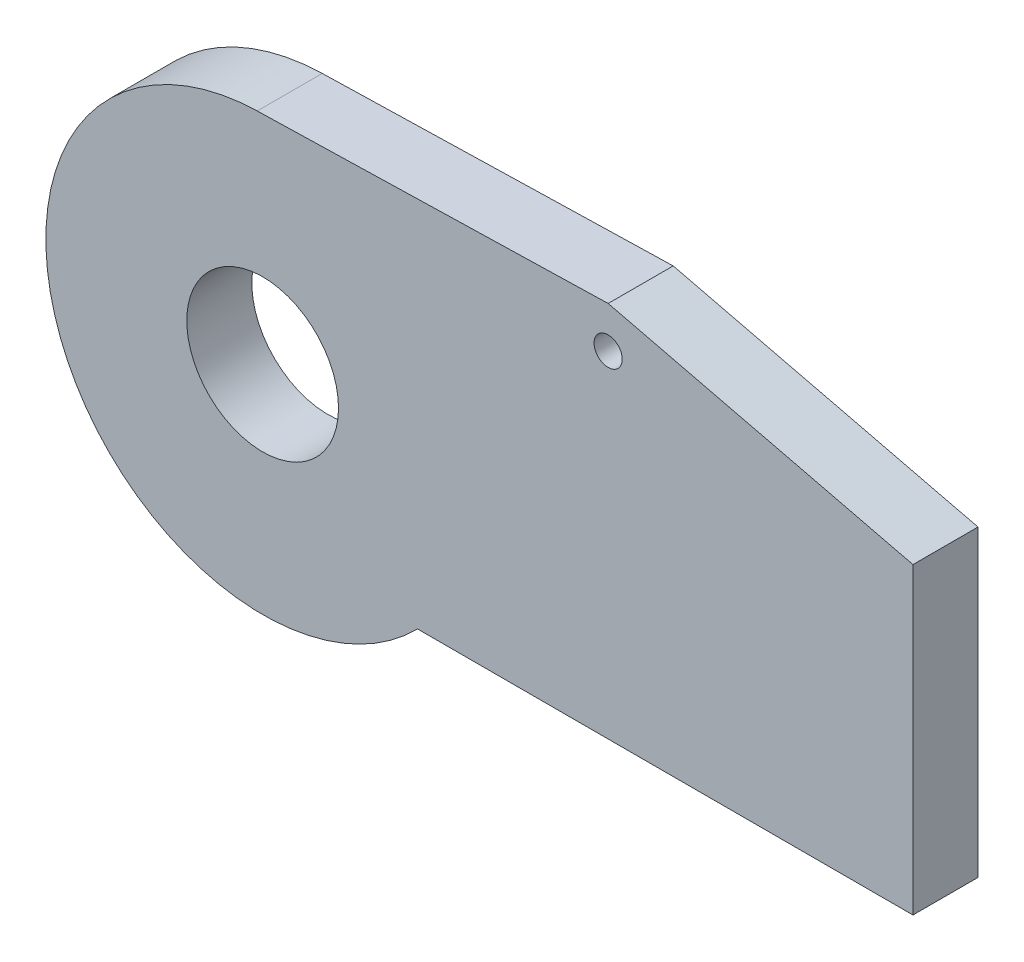
ISO-10303-21;
HEADER;
FILE_DESCRIPTION(('STEP AP214'),'2;1');
FILE_NAME('part.step','',(''),(''),'','','');
FILE_SCHEMA(('AUTOMOTIVE_DESIGN { 1 0 10303 214 1 1 1 1 }'));
ENDSEC;
DATA;
#1=APPLICATION_CONTEXT('core data for automotive mechanical design processes');
#2=APPLICATION_PROTOCOL_DEFINITION('international standard','automotive_design',2000,#1);
#3=PRODUCT_CONTEXT('',#1,'mechanical');
#4=PRODUCT('Part','Part','',(#3));
#5=PRODUCT_RELATED_PRODUCT_CATEGORY('part','',(#4));
#6=PRODUCT_DEFINITION_FORMATION('','',#4);
#7=PRODUCT_DEFINITION_CONTEXT('part definition',#1,'design');
#8=PRODUCT_DEFINITION('design','',#6,#7);
#9=PRODUCT_DEFINITION_SHAPE('','',#8);
#10=(LENGTH_UNIT() NAMED_UNIT(*) SI_UNIT(.MILLI.,.METRE.));
#11=(NAMED_UNIT(*) PLANE_ANGLE_UNIT() SI_UNIT($,.RADIAN.));
#12=(NAMED_UNIT(*) SI_UNIT($,.STERADIAN.) SOLID_ANGLE_UNIT());
#13=UNCERTAINTY_MEASURE_WITH_UNIT(LENGTH_MEASURE(1.E-05),#10,'distance_accuracy_value','');
#14=(GEOMETRIC_REPRESENTATION_CONTEXT(3) GLOBAL_UNCERTAINTY_ASSIGNED_CONTEXT((#13)) GLOBAL_UNIT_ASSIGNED_CONTEXT((#10,
#11,#12)) REPRESENTATION_CONTEXT('',''));
#15=CARTESIAN_POINT('',(0.,0.,0.));
#16=DIRECTION('',(0.,0.,1.));
#17=DIRECTION('',(1.,0.,0.));
#18=AXIS2_PLACEMENT_3D('',#15,#16,#17);
#19=CARTESIAN_POINT('',(-9.41902956497563E-05,35.0001154285683,15.));
#20=DIRECTION('',(0.,0.,1.));
#21=DIRECTION('',(1.,0.,0.));
#22=AXIS2_PLACEMENT_3D('',#19,#20,#21);
#23=PLANE('',#22);
#24=CARTESIAN_POINT('',(-9.41902956497563E-05,35.0001154285683,15.));
#25=DIRECTION('',(0.,0.,1.));
#26=DIRECTION('',(1.,0.,0.));
#27=AXIS2_PLACEMENT_3D('',#24,#25,#26);
#28=CIRCLE('',#27,17.5);
#29=CARTESIAN_POINT('',(17.4999058097044,35.0001154285683,15.));
#30=VERTEX_POINT('',#29);
#31=EDGE_CURVE('E112',#30,#30,#28,.T.);
#32=ORIENTED_EDGE('',*,*,#31,.F.);
#33=EDGE_LOOP('',(#32));
#34=FACE_BOUND('',#33,.T.);
#35=DIRECTION('',(0.,1.,0.));
#36=VECTOR('',#35,1.);
#37=CARTESIAN_POINT('',(149.999905809704,0.000115428568290179,15.));
#38=LINE('',#37,#36);
#39=CARTESIAN_POINT('',(149.999905809704,0.000115428568290179,15.));
#40=VERTEX_POINT('',#39);
#41=CARTESIAN_POINT('',(149.999905809704,70.0001154285683,15.));
#42=VERTEX_POINT('',#41);
#43=EDGE_CURVE('E117',#40,#42,#38,.T.);
#44=ORIENTED_EDGE('',*,*,#43,.T.);
#45=DIRECTION('',(-0.971972429465787,0.2350948667206,0.));
#46=VECTOR('',#45,1.);
#47=CARTESIAN_POINT('',(149.999905809704,70.0001154285683,15.));
#48=LINE('',#47,#46);
#49=CARTESIAN_POINT('',(79.6941068308149,87.0052607799767,15.));
#50=VERTEX_POINT('',#49);
#51=EDGE_CURVE('E84',#42,#50,#48,.T.);
#52=ORIENTED_EDGE('',*,*,#51,.T.);
#53=DIRECTION('',(-0.999688519740616,-0.0249572333966712,0.));
#54=VECTOR('',#53,1.);
#55=CARTESIAN_POINT('',(79.6941068308149,87.0052607799767,15.));
#56=LINE('',#55,#54);
#57=CARTESIAN_POINT('',(-1.24795586012921,84.9845414155991,15.));
#58=VERTEX_POINT('',#57);
#59=EDGE_CURVE('E88',#50,#58,#56,.T.);
#60=ORIENTED_EDGE('',*,*,#59,.T.);
#61=CARTESIAN_POINT('',(-9.41902956497563E-05,35.0001154285683,15.));
#62=DIRECTION('',(0.,0.,1.));
#63=DIRECTION('',(1.,0.,0.));
#64=AXIS2_PLACEMENT_3D('',#61,#62,#63);
#65=CIRCLE('',#64,50.);
#66=CARTESIAN_POINT('',(35.7070479524186,0.000115428568266129,15.));
#67=VERTEX_POINT('',#66);
#68=EDGE_CURVE('E92',#58,#67,#65,.T.);
#69=ORIENTED_EDGE('',*,*,#68,.T.);
#70=DIRECTION('',(1.,0.,0.));
#71=VECTOR('',#70,1.);
#72=CARTESIAN_POINT('',(35.7070479524186,0.000115428568290179,15.));
#73=LINE('',#72,#71);
#74=EDGE_CURVE('E50',#67,#40,#73,.T.);
#75=ORIENTED_EDGE('',*,*,#74,.T.);
#76=EDGE_LOOP('',(#44,#52,#60,#69,#75));
#77=FACE_BOUND('',#76,.T.);
#78=CARTESIAN_POINT('',(79.6941068308149,77.4793560855302,15.));
#79=DIRECTION('',(0.,0.,1.));
#80=DIRECTION('',(1.,0.,0.));
#81=AXIS2_PLACEMENT_3D('',#78,#79,#80);
#82=CIRCLE('',#81,3.25000000000001);
#83=CARTESIAN_POINT('',(82.9441068308149,77.4793560855302,15.));
#84=VERTEX_POINT('',#83);
#85=EDGE_CURVE('E154',#84,#84,#82,.T.);
#86=ORIENTED_EDGE('',*,*,#85,.F.);
#87=EDGE_LOOP('',(#86));
#88=FACE_BOUND('',#87,.T.);
#89=ADVANCED_FACE('F33',(#34,#77,#88),#23,.T.);
#90=CARTESIAN_POINT('',(-9.41902956497563E-05,35.0001154285683,0.));
#91=DIRECTION('',(0.,0.,1.));
#92=DIRECTION('',(1.,0.,0.));
#93=AXIS2_PLACEMENT_3D('',#90,#91,#92);
#94=PLANE('',#93);
#95=DIRECTION('',(0.,1.,0.));
#96=VECTOR('',#95,1.);
#97=CARTESIAN_POINT('',(149.999905809704,0.000115428568290179,0.));
#98=LINE('',#97,#96);
#99=CARTESIAN_POINT('',(149.999905809704,0.000115428568290179,0.));
#100=VERTEX_POINT('',#99);
#101=CARTESIAN_POINT('',(149.999905809704,70.0001154285683,0.));
#102=VERTEX_POINT('',#101);
#103=EDGE_CURVE('E108',#100,#102,#98,.T.);
#104=ORIENTED_EDGE('',*,*,#103,.F.);
#105=DIRECTION('',(1.,0.,0.));
#106=VECTOR('',#105,1.);
#107=CARTESIAN_POINT('',(35.7070479524186,0.000115428568290179,0.));
#108=LINE('',#107,#106);
#109=CARTESIAN_POINT('',(35.7070479524186,0.000115428568266129,0.));
#110=VERTEX_POINT('',#109);
#111=EDGE_CURVE('E76',#110,#100,#108,.T.);
#112=ORIENTED_EDGE('',*,*,#111,.F.);
#113=CARTESIAN_POINT('',(-9.41902956497563E-05,35.0001154285683,0.));
#114=DIRECTION('',(0.,0.,1.));
#115=DIRECTION('',(1.,0.,0.));
#116=AXIS2_PLACEMENT_3D('',#113,#114,#115);
#117=CIRCLE('',#116,50.);
#118=CARTESIAN_POINT('',(-1.24795586012921,84.9845414155991,0.));
#119=VERTEX_POINT('',#118);
#120=EDGE_CURVE('E70',#119,#110,#117,.T.);
#121=ORIENTED_EDGE('',*,*,#120,.F.);
#122=DIRECTION('',(-0.999688519740616,-0.0249572333966712,0.));
#123=VECTOR('',#122,1.);
#124=CARTESIAN_POINT('',(79.6941068308149,87.0052607799767,0.));
#125=LINE('',#124,#123);
#126=CARTESIAN_POINT('',(79.6941068308149,87.0052607799767,0.));
#127=VERTEX_POINT('',#126);
#128=EDGE_CURVE('E99',#127,#119,#125,.T.);
#129=ORIENTED_EDGE('',*,*,#128,.F.);
#130=DIRECTION('',(-0.971972429465787,0.2350948667206,0.));
#131=VECTOR('',#130,1.);
#132=CARTESIAN_POINT('',(149.999905809704,70.0001154285683,0.));
#133=LINE('',#132,#131);
#134=EDGE_CURVE('E111',#102,#127,#133,.T.);
#135=ORIENTED_EDGE('',*,*,#134,.F.);
#136=EDGE_LOOP('',(#104,#112,#121,#129,#135));
#137=FACE_BOUND('',#136,.T.);
#138=CARTESIAN_POINT('',(-9.41902956497563E-05,35.0001154285683,0.));
#139=DIRECTION('',(0.,0.,1.));
#140=DIRECTION('',(1.,0.,0.));
#141=AXIS2_PLACEMENT_3D('',#138,#139,#140);
#142=CIRCLE('',#141,17.5);
#143=CARTESIAN_POINT('',(17.4999058097044,35.0001154285683,0.));
#144=VERTEX_POINT('',#143);
#145=EDGE_CURVE('E160',#144,#144,#142,.T.);
#146=ORIENTED_EDGE('',*,*,#145,.T.);
#147=EDGE_LOOP('',(#146));
#148=FACE_BOUND('',#147,.T.);
#149=CARTESIAN_POINT('',(79.6941068308149,77.4793560855302,0.));
#150=DIRECTION('',(0.,0.,1.));
#151=DIRECTION('',(1.,0.,0.));
#152=AXIS2_PLACEMENT_3D('',#149,#150,#151);
#153=CIRCLE('',#152,3.25000000000001);
#154=CARTESIAN_POINT('',(82.9441068308149,77.4793560855302,0.));
#155=VERTEX_POINT('',#154);
#156=EDGE_CURVE('E157',#155,#155,#153,.T.);
#157=ORIENTED_EDGE('',*,*,#156,.T.);
#158=EDGE_LOOP('',(#157));
#159=FACE_BOUND('',#158,.T.);
#160=ADVANCED_FACE('F121',(#137,#148,#159),#94,.F.);
#161=CARTESIAN_POINT('',(149.999905809704,0.000115428568290179,15.));
#162=DIRECTION('',(-1.,0.,0.));
#163=DIRECTION('',(0.,0.,1.));
#164=AXIS2_PLACEMENT_3D('',#161,#162,#163);
#165=PLANE('',#164);
#166=ORIENTED_EDGE('',*,*,#103,.T.);
#167=DIRECTION('',(0.,0.,-1.));
#168=VECTOR('',#167,1.);
#169=CARTESIAN_POINT('',(149.999905809704,70.0001154285683,15.));
#170=LINE('',#169,#168);
#171=EDGE_CURVE('E11',#42,#102,#170,.T.);
#172=ORIENTED_EDGE('',*,*,#171,.F.);
#173=ORIENTED_EDGE('',*,*,#43,.F.);
#174=DIRECTION('',(0.,0.,-1.));
#175=VECTOR('',#174,1.);
#176=CARTESIAN_POINT('',(149.999905809704,0.000115428568290179,15.));
#177=LINE('',#176,#175);
#178=EDGE_CURVE('E104',#40,#100,#177,.T.);
#179=ORIENTED_EDGE('',*,*,#178,.T.);
#180=EDGE_LOOP('',(#166,#172,#173,#179));
#181=FACE_BOUND('',#180,.T.);
#182=ADVANCED_FACE('F35',(#181),#165,.F.);
#183=CARTESIAN_POINT('',(149.999905809704,70.0001154285683,15.));
#184=DIRECTION('',(-0.2350948667206,-0.971972429465787,0.));
#185=DIRECTION('',(0.971972429465787,-0.2350948667206,0.));
#186=AXIS2_PLACEMENT_3D('',#183,#184,#185);
#187=PLANE('',#186);
#188=ORIENTED_EDGE('',*,*,#134,.T.);
#189=DIRECTION('',(0.,0.,-1.));
#190=VECTOR('',#189,1.);
#191=CARTESIAN_POINT('',(79.6941068308149,87.0052607799767,15.));
#192=LINE('',#191,#190);
#193=EDGE_CURVE('E42',#50,#127,#192,.T.);
#194=ORIENTED_EDGE('',*,*,#193,.F.);
#195=ORIENTED_EDGE('',*,*,#51,.F.);
#196=ORIENTED_EDGE('',*,*,#171,.T.);
#197=EDGE_LOOP('',(#188,#194,#195,#196));
#198=FACE_BOUND('',#197,.T.);
#199=ADVANCED_FACE('F192',(#198),#187,.F.);
#200=CARTESIAN_POINT('',(79.6941068308149,87.0052607799767,15.));
#201=DIRECTION('',(0.0249572333966712,-0.999688519740616,0.));
#202=DIRECTION('',(0.999688519740616,0.0249572333966712,0.));
#203=AXIS2_PLACEMENT_3D('',#200,#201,#202);
#204=PLANE('',#203);
#205=ORIENTED_EDGE('',*,*,#128,.T.);
#206=DIRECTION('',(0.,0.,-1.));
#207=VECTOR('',#206,1.);
#208=CARTESIAN_POINT('',(-1.24795586012921,84.9845414155991,15.));
#209=LINE('',#208,#207);
#210=EDGE_CURVE('E96',#58,#119,#209,.T.);
#211=ORIENTED_EDGE('',*,*,#210,.F.);
#212=ORIENTED_EDGE('',*,*,#59,.F.);
#213=ORIENTED_EDGE('',*,*,#193,.T.);
#214=EDGE_LOOP('',(#205,#211,#212,#213));
#215=FACE_BOUND('',#214,.T.);
#216=ADVANCED_FACE('F97',(#215),#204,.F.);
#217=CARTESIAN_POINT('',(-9.41902956497563E-05,35.0001154285683,15.));
#218=DIRECTION('',(0.,0.,-1.));
#219=DIRECTION('',(-1.,0.,0.));
#220=AXIS2_PLACEMENT_3D('',#217,#218,#219);
#221=CYLINDRICAL_SURFACE('',#220,50.);
#222=ORIENTED_EDGE('',*,*,#120,.T.);
#223=DIRECTION('',(0.,0.,-1.));
#224=VECTOR('',#223,1.);
#225=CARTESIAN_POINT('',(35.7070479524186,0.000115428568266129,15.));
#226=LINE('',#225,#224);
#227=EDGE_CURVE('E100',#67,#110,#226,.T.);
#228=ORIENTED_EDGE('',*,*,#227,.F.);
#229=ORIENTED_EDGE('',*,*,#68,.F.);
#230=ORIENTED_EDGE('',*,*,#210,.T.);
#231=EDGE_LOOP('',(#222,#228,#229,#230));
#232=FACE_BOUND('',#231,.T.);
#233=ADVANCED_FACE('F102',(#232),#221,.T.);
#234=CARTESIAN_POINT('',(35.7070479524186,0.000115428568290179,15.));
#235=DIRECTION('',(0.,1.,0.));
#236=DIRECTION('',(0.,0.,1.));
#237=AXIS2_PLACEMENT_3D('',#234,#235,#236);
#238=PLANE('',#237);
#239=ORIENTED_EDGE('',*,*,#111,.T.);
#240=ORIENTED_EDGE('',*,*,#178,.F.);
#241=ORIENTED_EDGE('',*,*,#74,.F.);
#242=ORIENTED_EDGE('',*,*,#227,.T.);
#243=EDGE_LOOP('',(#239,#240,#241,#242));
#244=FACE_BOUND('',#243,.T.);
#245=ADVANCED_FACE('F126',(#244),#238,.F.);
#246=CARTESIAN_POINT('',(-9.41902956497563E-05,35.0001154285683,15.));
#247=DIRECTION('',(0.,0.,-1.));
#248=DIRECTION('',(-1.,0.,0.));
#249=AXIS2_PLACEMENT_3D('',#246,#247,#248);
#250=CYLINDRICAL_SURFACE('',#249,17.5);
#251=ORIENTED_EDGE('',*,*,#31,.T.);
#252=EDGE_LOOP('',(#251));
#253=FACE_BOUND('',#252,.T.);
#254=ORIENTED_EDGE('',*,*,#145,.F.);
#255=EDGE_LOOP('',(#254));
#256=FACE_BOUND('',#255,.T.);
#257=ADVANCED_FACE('F128',(#253,#256),#250,.F.);
#258=CARTESIAN_POINT('',(79.6941068308149,77.4793560855302,15.));
#259=DIRECTION('',(0.,0.,-1.));
#260=DIRECTION('',(-1.,0.,0.));
#261=AXIS2_PLACEMENT_3D('',#258,#259,#260);
#262=CYLINDRICAL_SURFACE('',#261,3.25000000000001);
#263=ORIENTED_EDGE('',*,*,#85,.T.);
#264=EDGE_LOOP('',(#263));
#265=FACE_BOUND('',#264,.T.);
#266=ORIENTED_EDGE('',*,*,#156,.F.);
#267=EDGE_LOOP('',(#266));
#268=FACE_BOUND('',#267,.T.);
#269=ADVANCED_FACE('F134',(#265,#268),#262,.F.);
#270=CLOSED_SHELL('',(#89,#160,#182,#199,#216,#233,#245,#257,#269));
#271=MANIFOLD_SOLID_BREP('B2',#270);
#272=ADVANCED_BREP_SHAPE_REPRESENTATION('',(#18,#271),#14);
#273=SHAPE_DEFINITION_REPRESENTATION(#9,#272);
ENDSEC;
END-ISO-10303-21;
